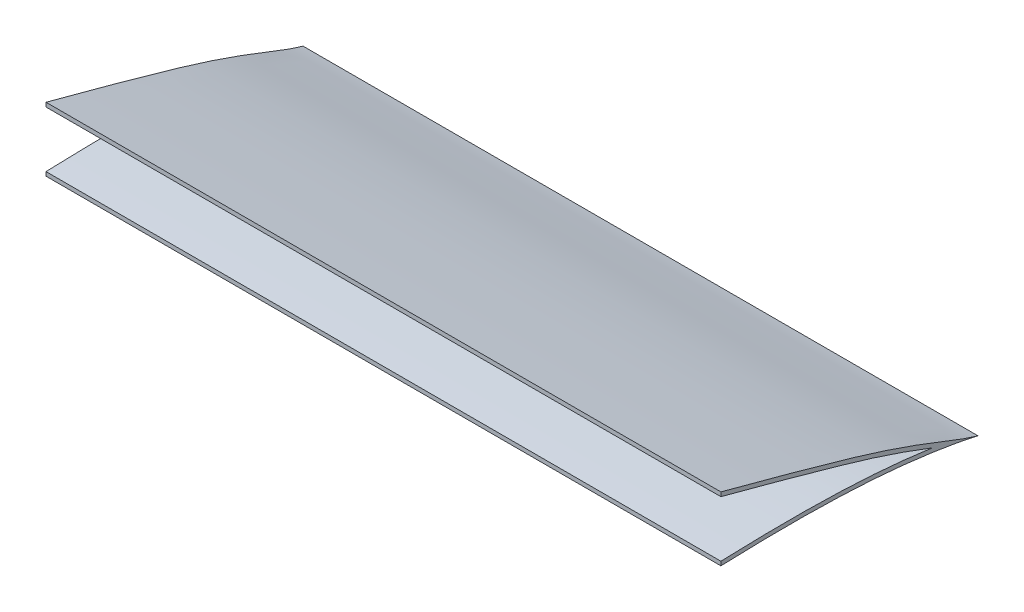
ISO-10303-21;
HEADER;
FILE_DESCRIPTION(('STEP AP214'),'2;1');
FILE_NAME('part.step','',(''),(''),'','','');
FILE_SCHEMA(('AUTOMOTIVE_DESIGN { 1 0 10303 214 1 1 1 1 }'));
ENDSEC;
DATA;
#1=APPLICATION_CONTEXT('core data for automotive mechanical design processes');
#2=APPLICATION_PROTOCOL_DEFINITION('international standard','automotive_design',2000,#1);
#3=PRODUCT_CONTEXT('',#1,'mechanical');
#4=PRODUCT('Part','Part','',(#3));
#5=PRODUCT_RELATED_PRODUCT_CATEGORY('part','',(#4));
#6=PRODUCT_DEFINITION_FORMATION('','',#4);
#7=PRODUCT_DEFINITION_CONTEXT('part definition',#1,'design');
#8=PRODUCT_DEFINITION('design','',#6,#7);
#9=PRODUCT_DEFINITION_SHAPE('','',#8);
#10=(LENGTH_UNIT() NAMED_UNIT(*) SI_UNIT(.MILLI.,.METRE.));
#11=(NAMED_UNIT(*) PLANE_ANGLE_UNIT() SI_UNIT($,.RADIAN.));
#12=(NAMED_UNIT(*) SI_UNIT($,.STERADIAN.) SOLID_ANGLE_UNIT());
#13=UNCERTAINTY_MEASURE_WITH_UNIT(LENGTH_MEASURE(1.E-05),#10,'distance_accuracy_value','');
#14=(GEOMETRIC_REPRESENTATION_CONTEXT(3) GLOBAL_UNCERTAINTY_ASSIGNED_CONTEXT((#13)) GLOBAL_UNIT_ASSIGNED_CONTEXT((#10,
#11,#12)) REPRESENTATION_CONTEXT('',''));
#15=CARTESIAN_POINT('',(0.,0.,0.));
#16=DIRECTION('',(0.,0.,1.));
#17=DIRECTION('',(1.,0.,0.));
#18=AXIS2_PLACEMENT_3D('',#15,#16,#17);
#19=CARTESIAN_POINT('',(266.7,-23.1184231765888,-784.106482277342));
#20=CARTESIAN_POINT('',(266.7,-21.5941948646314,-780.160330066746));
#21=CARTESIAN_POINT('',(266.7,-18.6420313640257,-772.229019430764));
#22=CARTESIAN_POINT('',(266.7,-14.6721592573552,-760.174514143023));
#23=CARTESIAN_POINT('',(266.7,-11.061270892252,-747.991113763068));
#24=CARTESIAN_POINT('',(266.7,-6.45595444735922,-731.645658465396));
#25=CARTESIAN_POINT('',(266.7,-0.845295728828582,-711.176791695));
#26=CARTESIAN_POINT('',(266.7,7.8115210058812,-678.329743560459));
#27=CARTESIAN_POINT('',(266.7,18.257538211217,-637.171287831332));
#28=CARTESIAN_POINT('',(266.7,30.1162057762093,-587.618318744646));
#29=CARTESIAN_POINT('',(266.7,41.1374524116112,-537.877742251688));
#30=CARTESIAN_POINT('',(266.7,51.0911698472495,-487.918910070674));
#31=CARTESIAN_POINT('',(266.7,59.7239737986415,-437.720761599895));
#32=CARTESIAN_POINT('',(266.7,66.7289053590127,-387.278741139135));
#33=CARTESIAN_POINT('',(266.7,70.9360377288318,-345.050560772716));
#34=CARTESIAN_POINT('',(266.7,73.0641477653892,-311.18788932569));
#35=CARTESIAN_POINT('',(266.7,74.2092196354668,-277.279562300467));
#36=CARTESIAN_POINT('',(266.7,73.8800008847884,-243.342738652409));
#37=CARTESIAN_POINT('',(266.7,71.9586220108794,-209.476353678726));
#38=CARTESIAN_POINT('',(266.7,69.6475228760495,-184.143820783248));
#39=CARTESIAN_POINT('',(266.7,66.4677558472745,-158.904994034112));
#40=CARTESIAN_POINT('',(266.7,62.3586391617327,-133.8071867013));
#41=CARTESIAN_POINT('',(266.7,57.1874016990518,-108.915504076387));
#42=CARTESIAN_POINT('',(266.7,51.8354380146184,-88.4250104282845));
#43=CARTESIAN_POINT('',(266.7,46.781142415969,-72.2737715807522));
#44=CARTESIAN_POINT('',(266.7,42.5401308058817,-60.3184424568568));
#45=CARTESIAN_POINT('',(266.7,37.7737253953122,-48.577097756103));
#46=CARTESIAN_POINT('',(266.7,32.3878283625538,-37.1196846287895));
#47=CARTESIAN_POINT('',(266.7,27.2537575462737,-27.9271564923142));
#48=CARTESIAN_POINT('',(266.7,22.6553737471211,-20.9063850305832));
#49=CARTESIAN_POINT('',(266.7,18.9075077927961,-15.8717047100105));
#50=CARTESIAN_POINT('',(266.7,14.8240531255331,-11.1186200473068));
#51=CARTESIAN_POINT('',(266.7,11.0807152552971,-7.55821558571599));
#52=CARTESIAN_POINT('',(266.7,7.83489505129662,-5.02510578688502));
#53=CARTESIAN_POINT('',(266.7,5.29547537768222,-3.38923844421585));
#54=CARTESIAN_POINT('',(266.7,3.06142620290842,-2.31109107008206));
#55=CARTESIAN_POINT('',(266.7,1.48593186176602,-1.80559091181272));
#56=CARTESIAN_POINT('',(266.7,0.72579482126348,-1.65397388534357));
#57=CARTESIAN_POINT('',(266.7,0.34989447911426,-1.61043534130219));
#58=CARTESIAN_POINT('',(266.7,0.100324503404875,-1.59546044383819));
#59=CARTESIAN_POINT('',(266.7,-0.0168698697803871,-1.58896756731634));
#60=B_SPLINE_CURVE_WITH_KNOTS('',3,(#19,#20,#21,#22,#23,#24,#25,#26,#27,#28,#29,#30,#31,#32,#33,
#34,#35,#36,#37,#38,#39,#40,#41,#42,#43,#44,#45,#46,#47,#48,#49,#50,#51,#52,#53,#54,#55,#56,#57,
#58,#59),.UNSPECIFIED.,.F.,.F.,(4,1,1,1,1,1,1,1,1,1,1,1,1,1,1,1,1,1,1,1,1,1,1,1,1,1,1,1,1,1,1,1,
1,1,1,1,1,1,4),(0.0222996498274626,0.0375748876942013,0.05285012556094,0.0681253634276787,
0.0834006012944174,0.113951077027895,0.144501552761372,0.205602504228327,0.266703455695282,
0.327804407162237,0.388905358629191,0.450006310096146,0.511107261563101,0.572208213030056,
0.602758688763533,0.633309164497011,0.694410115963965,0.724960591697443,0.75551106743092,
0.786061543164398,0.816612018897875,0.847162494631353,0.87771297036483,0.892988208231569,
0.908263446098307,0.923538683965046,0.938813921831785,0.954089159698523,0.961726778631893,
0.969364397565262,0.977002016498631,0.984639635432001,0.988458444898685,0.99227725436537,
0.996096063832055,0.998005468565397,0.998960170932068,0.999437522115404,0.999914873298739),.UNSPECIFIED.);
#61=DIRECTION('',(-1.,0.,0.));
#62=VECTOR('',#61,1.);
#63=SURFACE_OF_LINEAR_EXTRUSION('',#60,#62);
#64=CARTESIAN_POINT('',(0.,-23.1184231765888,-784.106482277342));
#65=CARTESIAN_POINT('',(0.,-21.5941948646314,-780.160330066746));
#66=CARTESIAN_POINT('',(0.,-18.6420313640257,-772.229019430764));
#67=CARTESIAN_POINT('',(0.,-14.6721592573552,-760.174514143023));
#68=CARTESIAN_POINT('',(0.,-11.061270892252,-747.991113763068));
#69=CARTESIAN_POINT('',(0.,-6.45595444735922,-731.645658465396));
#70=CARTESIAN_POINT('',(0.,-0.845295728828582,-711.176791695));
#71=CARTESIAN_POINT('',(0.,7.8115210058812,-678.329743560459));
#72=CARTESIAN_POINT('',(0.,18.257538211217,-637.171287831332));
#73=CARTESIAN_POINT('',(0.,30.1162057762093,-587.618318744646));
#74=CARTESIAN_POINT('',(0.,41.1374524116112,-537.877742251688));
#75=CARTESIAN_POINT('',(0.,51.0911698472495,-487.918910070674));
#76=CARTESIAN_POINT('',(0.,59.7239737986415,-437.720761599895));
#77=CARTESIAN_POINT('',(0.,66.7289053590127,-387.278741139135));
#78=CARTESIAN_POINT('',(0.,70.9360377288318,-345.050560772716));
#79=CARTESIAN_POINT('',(0.,73.0641477653892,-311.18788932569));
#80=CARTESIAN_POINT('',(0.,74.2092196354668,-277.279562300467));
#81=CARTESIAN_POINT('',(0.,73.8800008847884,-243.342738652409));
#82=CARTESIAN_POINT('',(0.,71.9586220108794,-209.476353678726));
#83=CARTESIAN_POINT('',(0.,69.6475228760495,-184.143820783248));
#84=CARTESIAN_POINT('',(0.,66.4677558472745,-158.904994034112));
#85=CARTESIAN_POINT('',(0.,62.3586391617327,-133.8071867013));
#86=CARTESIAN_POINT('',(0.,57.1874016990518,-108.915504076387));
#87=CARTESIAN_POINT('',(0.,51.8354380146184,-88.4250104282845));
#88=CARTESIAN_POINT('',(0.,46.781142415969,-72.2737715807522));
#89=CARTESIAN_POINT('',(0.,42.5401308058817,-60.3184424568568));
#90=CARTESIAN_POINT('',(0.,37.7737253953122,-48.577097756103));
#91=CARTESIAN_POINT('',(0.,32.3878283625538,-37.1196846287895));
#92=CARTESIAN_POINT('',(0.,27.2537575462737,-27.9271564923142));
#93=CARTESIAN_POINT('',(0.,22.6553737471211,-20.9063850305832));
#94=CARTESIAN_POINT('',(0.,18.9075077927961,-15.8717047100105));
#95=CARTESIAN_POINT('',(0.,14.8240531255331,-11.1186200473068));
#96=CARTESIAN_POINT('',(0.,11.0807152552971,-7.55821558571599));
#97=CARTESIAN_POINT('',(0.,7.83489505129662,-5.02510578688502));
#98=CARTESIAN_POINT('',(0.,5.29547537768222,-3.38923844421585));
#99=CARTESIAN_POINT('',(0.,3.06142620290842,-2.31109107008206));
#100=CARTESIAN_POINT('',(0.,1.48593186176602,-1.80559091181272));
#101=CARTESIAN_POINT('',(0.,0.72579482126348,-1.65397388534357));
#102=CARTESIAN_POINT('',(0.,0.34989447911426,-1.61043534130219));
#103=CARTESIAN_POINT('',(0.,0.100324503404875,-1.59546044383819));
#104=CARTESIAN_POINT('',(0.,-0.0168698697803871,-1.58896756731634));
#105=B_SPLINE_CURVE_WITH_KNOTS('',3,(#64,#65,#66,#67,#68,#69,#70,#71,#72,#73,#74,#75,#76,#77,
#78,#79,#80,#81,#82,#83,#84,#85,#86,#87,#88,#89,#90,#91,#92,#93,#94,#95,#96,#97,#98,#99,#100,
#101,#102,#103,#104),.UNSPECIFIED.,.F.,.F.,(4,1,1,1,1,1,1,1,1,1,1,1,1,1,1,1,1,1,1,1,1,1,1,1,1,1,
1,1,1,1,1,1,1,1,1,1,1,1,4),(0.0222996498274626,0.0375748876942013,0.05285012556094,
0.0681253634276787,0.0834006012944174,0.113951077027895,0.144501552761372,0.205602504228327,
0.266703455695282,0.327804407162237,0.388905358629191,0.450006310096146,0.511107261563101,
0.572208213030056,0.602758688763533,0.633309164497011,0.694410115963965,0.724960591697443,
0.75551106743092,0.786061543164398,0.816612018897875,0.847162494631353,0.87771297036483,
0.892988208231569,0.908263446098307,0.923538683965046,0.938813921831785,0.954089159698523,
0.961726778631893,0.969364397565262,0.977002016498631,0.984639635432001,0.988458444898685,
0.99227725436537,0.996096063832055,0.998005468565397,0.998960170932068,0.999437522115404,
0.999914873298739),.UNSPECIFIED.);
#106=CARTESIAN_POINT('',(0.,-23.1184231765888,-784.106482277342));
#107=VERTEX_POINT('',#106);
#108=CARTESIAN_POINT('',(0.,1.94501203006148,-700.551053398584));
#109=VERTEX_POINT('',#108);
#110=EDGE_CURVE('E122',#107,#109,#105,.T.);
#111=ORIENTED_EDGE('',*,*,#110,.F.);
#112=DIRECTION('',(-1.,0.,0.));
#113=VECTOR('',#112,1.);
#114=CARTESIAN_POINT('',(266.7,-23.1184231765888,-784.106482277342));
#115=LINE('',#114,#113);
#116=CARTESIAN_POINT('',(266.7,-23.1184231765888,-784.106482277342));
#117=VERTEX_POINT('',#116);
#118=EDGE_CURVE('E11',#117,#107,#115,.T.);
#119=ORIENTED_EDGE('',*,*,#118,.F.);
#120=CARTESIAN_POINT('',(266.7,1.94501203006148,-700.551053398584));
#121=VERTEX_POINT('',#120);
#122=EDGE_CURVE('E146',#117,#121,#60,.T.);
#123=ORIENTED_EDGE('',*,*,#122,.T.);
#124=DIRECTION('',(-1.,0.,0.));
#125=VECTOR('',#124,1.);
#126=CARTESIAN_POINT('',(266.7,1.94501203006148,-700.551053398584));
#127=LINE('',#126,#125);
#128=EDGE_CURVE('E81',#121,#109,#127,.T.);
#129=ORIENTED_EDGE('',*,*,#128,.T.);
#130=EDGE_LOOP('',(#111,#119,#123,#129));
#131=FACE_BOUND('',#130,.T.);
#132=ADVANCED_FACE('F35',(#131),#63,.T.);
#133=CARTESIAN_POINT('',(266.7,-0.0168698697803817,-1.58896756731634));
#134=CARTESIAN_POINT('',(266.7,-0.278093575405853,-1.59778567538342));
#135=CARTESIAN_POINT('',(266.7,-0.817071560687652,-1.61698852295705));
#136=CARTESIAN_POINT('',(266.7,-1.5250777063707,-1.67055282833132));
#137=CARTESIAN_POINT('',(266.7,-2.23953985681244,-1.77272911801303));
#138=CARTESIAN_POINT('',(266.7,-3.2170399545111,-1.96449824112025));
#139=CARTESIAN_POINT('',(266.7,-4.47308667544305,-2.28220569209763));
#140=CARTESIAN_POINT('',(266.7,-6.45569044251883,-2.89195735088694));
#141=CARTESIAN_POINT('',(266.7,-8.91270651117956,-3.82502314776842));
#142=CARTESIAN_POINT('',(266.7,-12.764870838745,-5.5748206630622));
#143=CARTESIAN_POINT('',(266.7,-17.4946939025467,-8.15485573251682));
#144=CARTESIAN_POINT('',(266.7,-25.0362925123383,-12.5101141172109));
#145=CARTESIAN_POINT('',(266.7,-34.2942736430627,-18.1123469115671));
#146=CARTESIAN_POINT('',(266.7,-45.1810251619868,-25.230105591362));
#147=CARTESIAN_POINT('',(266.7,-53.8227317037622,-31.689080193494));
#148=CARTESIAN_POINT('',(266.7,-60.4726069561864,-37.2128263714012));
#149=CARTESIAN_POINT('',(266.7,-66.962933883926,-42.9501181028563));
#150=CARTESIAN_POINT('',(266.7,-74.4394415189749,-50.6018486257846));
#151=CARTESIAN_POINT('',(266.7,-81.5128401744618,-61.3489491705267));
#152=CARTESIAN_POINT('',(266.7,-86.5672767678429,-73.159446713042));
#153=CARTESIAN_POINT('',(266.7,-90.1112052326867,-85.6410448979768));
#154=CARTESIAN_POINT('',(266.7,-92.857558138955,-98.3222524640694));
#155=CARTESIAN_POINT('',(266.7,-95.4884593166877,-115.423728280371));
#156=CARTESIAN_POINT('',(266.7,-97.1574166185787,-137.057042994171));
#157=CARTESIAN_POINT('',(266.7,-97.3913575328663,-163.09710904146));
#158=CARTESIAN_POINT('',(266.7,-96.2564047503436,-189.13539327614));
#159=CARTESIAN_POINT('',(266.7,-94.0860606996018,-215.119495237718));
#160=CARTESIAN_POINT('',(266.7,-91.1098097619557,-241.033805840036));
#161=CARTESIAN_POINT('',(266.7,-86.3075505253941,-275.492090275555));
#162=CARTESIAN_POINT('',(266.7,-79.1224787107728,-318.404073319138));
#163=CARTESIAN_POINT('',(266.7,-69.4844112272533,-369.735601224399));
#164=CARTESIAN_POINT('',(266.7,-59.4768027176839,-421.013521647914));
#165=CARTESIAN_POINT('',(266.7,-49.6150737617801,-472.334965082267));
#166=CARTESIAN_POINT('',(266.7,-40.3589258634731,-523.784524343132));
#167=CARTESIAN_POINT('',(266.7,-32.1357040424635,-575.425677634064));
#168=CARTESIAN_POINT('',(266.7,-25.4119138999749,-627.302116658694));
#169=CARTESIAN_POINT('',(266.7,-21.5032379052925,-670.741751073083));
#170=CARTESIAN_POINT('',(266.7,-19.8162969755378,-705.603952790565));
#171=CARTESIAN_POINT('',(266.7,-19.41220767749,-731.78903132868));
#172=CARTESIAN_POINT('',(266.7,-20.1502189024007,-758.00034587372));
#173=CARTESIAN_POINT('',(266.7,-21.867269156407,-775.446944988084));
#174=CARTESIAN_POINT('',(266.7,-23.1184231765888,-784.106482277342));
#175=B_SPLINE_CURVE_WITH_KNOTS('',3,(#133,#134,#135,#136,#137,#138,#139,#140,#141,#142,#143,
#144,#145,#146,#147,#148,#149,#150,#151,#152,#153,#154,#155,#156,#157,#158,#159,#160,#161,#162,
#163,#164,#165,#166,#167,#168,#169,#170,#171,#172,#173,#174),.UNSPECIFIED.,.F.,.F.,(4,1,1,1,1,1,
1,1,1,1,1,1,1,1,1,1,1,1,1,1,1,1,1,1,1,1,1,1,1,1,1,1,1,1,1,1,1,1,1,4),(8.23654502113766E-05,
0.00103762246756374,0.00199287948491611,0.00294813650226847,0.00390339351962084,
0.00581390755432556,0.00772442158903029,0.0115454496584398,0.0153664777278492,
0.0230085338666681,0.030650590005487,0.0459347022831249,0.0612188145607627,0.0765029268384006,
0.0841449829772195,0.0917870391160384,0.107071151393676,0.122355263671314,0.137639375948952,
0.15292348822659,0.168207600504228,0.183491712781865,0.214059937337141,0.244628161892417,
0.275196386447692,0.305764611002968,0.336332835558244,0.366901060113519,0.428037509224071,
0.489173958334622,0.550310407445173,0.611446856555725,0.672583305666276,0.733719754776827,
0.794856203887379,0.85599265299793,0.886560877553206,0.917129102108482,0.947697326663757,
0.978265551219033),.UNSPECIFIED.);
#176=DIRECTION('',(-1.,0.,0.));
#177=VECTOR('',#176,1.);
#178=SURFACE_OF_LINEAR_EXTRUSION('',#175,#177);
#179=CARTESIAN_POINT('',(0.,-0.0168698697803817,-1.58896756731634));
#180=CARTESIAN_POINT('',(0.,-0.278093575405853,-1.59778567538342));
#181=CARTESIAN_POINT('',(0.,-0.817071560687652,-1.61698852295705));
#182=CARTESIAN_POINT('',(0.,-1.5250777063707,-1.67055282833132));
#183=CARTESIAN_POINT('',(0.,-2.23953985681244,-1.77272911801303));
#184=CARTESIAN_POINT('',(0.,-3.2170399545111,-1.96449824112025));
#185=CARTESIAN_POINT('',(0.,-4.47308667544305,-2.28220569209763));
#186=CARTESIAN_POINT('',(0.,-6.45569044251883,-2.89195735088694));
#187=CARTESIAN_POINT('',(0.,-8.91270651117956,-3.82502314776842));
#188=CARTESIAN_POINT('',(0.,-12.764870838745,-5.5748206630622));
#189=CARTESIAN_POINT('',(0.,-17.4946939025467,-8.15485573251682));
#190=CARTESIAN_POINT('',(0.,-25.0362925123383,-12.5101141172109));
#191=CARTESIAN_POINT('',(0.,-34.2942736430627,-18.1123469115671));
#192=CARTESIAN_POINT('',(0.,-45.1810251619868,-25.230105591362));
#193=CARTESIAN_POINT('',(0.,-53.8227317037622,-31.689080193494));
#194=CARTESIAN_POINT('',(0.,-60.4726069561864,-37.2128263714012));
#195=CARTESIAN_POINT('',(0.,-66.962933883926,-42.9501181028563));
#196=CARTESIAN_POINT('',(0.,-74.4394415189749,-50.6018486257846));
#197=CARTESIAN_POINT('',(0.,-81.5128401744618,-61.3489491705267));
#198=CARTESIAN_POINT('',(0.,-86.5672767678429,-73.159446713042));
#199=CARTESIAN_POINT('',(0.,-90.1112052326867,-85.6410448979768));
#200=CARTESIAN_POINT('',(0.,-92.857558138955,-98.3222524640694));
#201=CARTESIAN_POINT('',(0.,-95.4884593166877,-115.423728280371));
#202=CARTESIAN_POINT('',(0.,-97.1574166185787,-137.057042994171));
#203=CARTESIAN_POINT('',(0.,-97.3913575328663,-163.09710904146));
#204=CARTESIAN_POINT('',(0.,-96.2564047503436,-189.13539327614));
#205=CARTESIAN_POINT('',(0.,-94.0860606996018,-215.119495237718));
#206=CARTESIAN_POINT('',(0.,-91.1098097619557,-241.033805840036));
#207=CARTESIAN_POINT('',(0.,-86.3075505253941,-275.492090275555));
#208=CARTESIAN_POINT('',(0.,-79.1224787107728,-318.404073319138));
#209=CARTESIAN_POINT('',(0.,-69.4844112272533,-369.735601224399));
#210=CARTESIAN_POINT('',(0.,-59.4768027176839,-421.013521647914));
#211=CARTESIAN_POINT('',(0.,-49.6150737617801,-472.334965082267));
#212=CARTESIAN_POINT('',(0.,-40.3589258634731,-523.784524343132));
#213=CARTESIAN_POINT('',(0.,-32.1357040424635,-575.425677634064));
#214=CARTESIAN_POINT('',(0.,-25.4119138999749,-627.302116658694));
#215=CARTESIAN_POINT('',(0.,-21.5032379052925,-670.741751073083));
#216=CARTESIAN_POINT('',(0.,-19.8162969755378,-705.603952790565));
#217=CARTESIAN_POINT('',(0.,-19.41220767749,-731.78903132868));
#218=CARTESIAN_POINT('',(0.,-20.1502189024007,-758.00034587372));
#219=CARTESIAN_POINT('',(0.,-21.867269156407,-775.446944988084));
#220=CARTESIAN_POINT('',(0.,-23.1184231765888,-784.106482277342));
#221=B_SPLINE_CURVE_WITH_KNOTS('',3,(#179,#180,#181,#182,#183,#184,#185,#186,#187,#188,#189,
#190,#191,#192,#193,#194,#195,#196,#197,#198,#199,#200,#201,#202,#203,#204,#205,#206,#207,#208,
#209,#210,#211,#212,#213,#214,#215,#216,#217,#218,#219,#220),.UNSPECIFIED.,.F.,.F.,(4,1,1,1,1,1,
1,1,1,1,1,1,1,1,1,1,1,1,1,1,1,1,1,1,1,1,1,1,1,1,1,1,1,1,1,1,1,1,1,4),(8.23654502113766E-05,
0.00103762246756374,0.00199287948491611,0.00294813650226847,0.00390339351962084,
0.00581390755432556,0.00772442158903029,0.0115454496584398,0.0153664777278492,
0.0230085338666681,0.030650590005487,0.0459347022831249,0.0612188145607627,0.0765029268384006,
0.0841449829772195,0.0917870391160384,0.107071151393676,0.122355263671314,0.137639375948952,
0.15292348822659,0.168207600504228,0.183491712781865,0.214059937337141,0.244628161892417,
0.275196386447692,0.305764611002968,0.336332835558244,0.366901060113519,0.428037509224071,
0.489173958334622,0.550310407445173,0.611446856555725,0.672583305666276,0.733719754776827,
0.794856203887379,0.85599265299793,0.886560877553206,0.917129102108482,0.947697326663757,
0.978265551219033),.UNSPECIFIED.);
#222=CARTESIAN_POINT('',(0.,-20.1371548542674,-700.551053398605));
#223=VERTEX_POINT('',#222);
#224=EDGE_CURVE('E164',#223,#107,#221,.T.);
#225=ORIENTED_EDGE('',*,*,#224,.F.);
#226=DIRECTION('',(-1.,0.,0.));
#227=VECTOR('',#226,1.);
#228=CARTESIAN_POINT('',(266.7,-20.1371548542674,-700.551053398605));
#229=LINE('',#228,#227);
#230=CARTESIAN_POINT('',(266.7,-20.1371548542674,-700.551053398605));
#231=VERTEX_POINT('',#230);
#232=EDGE_CURVE('E44',#231,#223,#229,.T.);
#233=ORIENTED_EDGE('',*,*,#232,.F.);
#234=EDGE_CURVE('E141',#231,#117,#175,.T.);
#235=ORIENTED_EDGE('',*,*,#234,.T.);
#236=ORIENTED_EDGE('',*,*,#118,.T.);
#237=EDGE_LOOP('',(#225,#233,#235,#236));
#238=FACE_BOUND('',#237,.T.);
#239=ADVANCED_FACE('F137',(#238),#178,.T.);
#240=CARTESIAN_POINT('',(266.7,6.69871026456157E-10,-700.551053398586));
#241=DIRECTION('',(0.,9.56205865663051E-13,-1.));
#242=DIRECTION('',(0.,1.,9.56205865663051E-13));
#243=AXIS2_PLACEMENT_3D('',#240,#241,#242);
#244=PLANE('',#243);
#245=DIRECTION('',(0.,-1.,-9.56205865663051E-13));
#246=VECTOR('',#245,1.);
#247=CARTESIAN_POINT('',(0.,6.69871026456157E-10,-700.551053398586));
#248=LINE('',#247,#246);
#249=CARTESIAN_POINT('',(0.,-21.7251284021518,-700.551053398607));
#250=VERTEX_POINT('',#249);
#251=EDGE_CURVE('E158',#223,#250,#248,.T.);
#252=ORIENTED_EDGE('',*,*,#251,.T.);
#253=DIRECTION('',(-1.,0.,0.));
#254=VECTOR('',#253,1.);
#255=CARTESIAN_POINT('',(266.7,-21.7251284021518,-700.551053398607));
#256=LINE('',#255,#254);
#257=CARTESIAN_POINT('',(266.7,-21.7251284021518,-700.551053398607));
#258=VERTEX_POINT('',#257);
#259=EDGE_CURVE('E109',#258,#250,#256,.T.);
#260=ORIENTED_EDGE('',*,*,#259,.F.);
#261=DIRECTION('',(0.,-1.,-9.56205865663051E-13));
#262=VECTOR('',#261,1.);
#263=CARTESIAN_POINT('',(266.7,6.69871026456157E-10,-700.551053398586));
#264=LINE('',#263,#262);
#265=EDGE_CURVE('E100',#231,#258,#264,.T.);
#266=ORIENTED_EDGE('',*,*,#265,.F.);
#267=ORIENTED_EDGE('',*,*,#232,.T.);
#268=EDGE_LOOP('',(#252,#260,#266,#267));
#269=FACE_BOUND('',#268,.T.);
#270=ADVANCED_FACE('F136',(#269),#244,.F.);
#271=CARTESIAN_POINT('',(266.7,0.,0.));
#272=CARTESIAN_POINT('',(266.7,-0.519005663292632,-0.0174520328861116));
#273=CARTESIAN_POINT('',(266.7,-1.83376590693266,-0.061662030289511));
#274=CARTESIAN_POINT('',(266.7,-4.39681155697538,-0.570189514846942));
#275=CARTESIAN_POINT('',(266.7,-10.616386461847,-2.53612961983818));
#276=CARTESIAN_POINT('',(266.7,-20.5501355548529,-7.99821180017807));
#277=CARTESIAN_POINT('',(266.7,-34.1849518234535,-16.113653600375));
#278=CARTESIAN_POINT('',(266.7,-48.9001609581786,-25.7512677237822));
#279=CARTESIAN_POINT('',(266.7,-62.9387722638163,-36.9320129206869));
#280=CARTESIAN_POINT('',(266.7,-75.9185649305712,-49.3363693896182));
#281=CARTESIAN_POINT('',(266.7,-85.624987008219,-65.2269065390065));
#282=CARTESIAN_POINT('',(266.7,-91.71735718507,-84.4527650462028));
#283=CARTESIAN_POINT('',(266.7,-96.1515107337894,-106.852134497523));
#284=CARTESIAN_POINT('',(266.7,-98.5722491750476,-132.510932075963));
#285=CARTESIAN_POINT('',(266.7,-99.0923828679645,-161.194365788224));
#286=CARTESIAN_POINT('',(266.7,-97.7042437107787,-192.761343292225));
#287=CARTESIAN_POINT('',(266.7,-94.5118392960459,-227.038217577419));
#288=CARTESIAN_POINT('',(266.7,-89.663828122523,-263.83475650239));
#289=CARTESIAN_POINT('',(266.7,-83.3884450275924,-302.921473177171));
#290=CARTESIAN_POINT('',(266.7,-75.9777868038423,-344.017776041379));
#291=CARTESIAN_POINT('',(266.7,-67.7807073824771,-386.776799789042));
#292=CARTESIAN_POINT('',(266.7,-59.2023239554423,-430.774614869895));
#293=CARTESIAN_POINT('',(266.7,-50.6638051202139,-475.496263681326));
#294=CARTESIAN_POINT('',(266.7,-42.603612471025,-520.335279967164));
#295=CARTESIAN_POINT('',(266.7,-35.4227963472458,-564.588870456427));
#296=CARTESIAN_POINT('',(266.7,-29.4733080838417,-607.47093439983));
#297=CARTESIAN_POINT('',(266.7,-25.014473383068,-648.127538759033));
#298=CARTESIAN_POINT('',(266.7,-22.1862417823146,-685.667615873141));
#299=CARTESIAN_POINT('',(266.7,-21.0047614095552,-719.196759596274));
#300=CARTESIAN_POINT('',(266.7,-21.2786363123237,-747.830287498204));
#301=CARTESIAN_POINT('',(266.7,-22.8547119223691,-770.688405742871));
#302=CARTESIAN_POINT('',(266.7,-25.0735156397946,-787.091395164099));
#303=CARTESIAN_POINT('',(266.7,-26.8193281874914,-796.842303094868));
#304=CARTESIAN_POINT('',(266.7,-27.775140745329,-801.097715575015));
#305=CARTESIAN_POINT('',(266.7,-28.0117320332953,-802.151053398607));
#306=B_SPLINE_CURVE_WITH_KNOTS('',3,(#271,#272,#273,#274,#275,#276,#277,#278,#279,#280,#281,
#282,#283,#284,#285,#286,#287,#288,#289,#290,#291,#292,#293,#294,#295,#296,#297,#298,#299,#300,
#301,#302,#303,#304,#305),.UNSPECIFIED.,.F.,.F.,(4,1,1,1,1,1,1,1,1,1,1,1,1,1,1,1,1,1,1,1,1,1,1,
1,1,1,1,1,1,1,1,1,4),(0.,0.00182090933464196,0.00461278049497482,0.00913453013845994,
0.0246759391487866,0.0441527676320363,0.064937102928184,0.0863209881898911,0.107137618403306,
0.127599776801144,0.150892792929449,0.177565203441126,0.207667777211646,0.241222088418686,
0.278203414074027,0.318526302563412,0.362030578586225,0.408464624639153,0.457479061609077,
0.508614437318857,0.56129601455956,0.61483529472868,0.668437533813961,0.721214466101836,
0.772202341152847,0.82039348306447,0.86476592329606,0.904323703961063,0.938131580580512,
0.965241743376092,0.984690446789536,0.996210442222917,1.),.UNSPECIFIED.);
#307=DIRECTION('',(-1.,0.,0.));
#308=VECTOR('',#307,1.);
#309=SURFACE_OF_LINEAR_EXTRUSION('',#306,#308);
#310=CARTESIAN_POINT('',(0.,0.,0.));
#311=CARTESIAN_POINT('',(0.,-0.519005663292632,-0.0174520328861116));
#312=CARTESIAN_POINT('',(0.,-1.83376590693266,-0.061662030289511));
#313=CARTESIAN_POINT('',(0.,-4.39681155697538,-0.570189514846942));
#314=CARTESIAN_POINT('',(0.,-10.616386461847,-2.53612961983818));
#315=CARTESIAN_POINT('',(0.,-20.5501355548529,-7.99821180017807));
#316=CARTESIAN_POINT('',(0.,-34.1849518234535,-16.113653600375));
#317=CARTESIAN_POINT('',(0.,-48.9001609581786,-25.7512677237822));
#318=CARTESIAN_POINT('',(0.,-62.9387722638163,-36.9320129206869));
#319=CARTESIAN_POINT('',(0.,-75.9185649305712,-49.3363693896182));
#320=CARTESIAN_POINT('',(0.,-85.624987008219,-65.2269065390065));
#321=CARTESIAN_POINT('',(0.,-91.71735718507,-84.4527650462028));
#322=CARTESIAN_POINT('',(0.,-96.1515107337894,-106.852134497523));
#323=CARTESIAN_POINT('',(0.,-98.5722491750476,-132.510932075963));
#324=CARTESIAN_POINT('',(0.,-99.0923828679645,-161.194365788224));
#325=CARTESIAN_POINT('',(0.,-97.7042437107787,-192.761343292225));
#326=CARTESIAN_POINT('',(0.,-94.5118392960459,-227.038217577419));
#327=CARTESIAN_POINT('',(0.,-89.663828122523,-263.83475650239));
#328=CARTESIAN_POINT('',(0.,-83.3884450275924,-302.921473177171));
#329=CARTESIAN_POINT('',(0.,-75.9777868038423,-344.017776041379));
#330=CARTESIAN_POINT('',(0.,-67.7807073824771,-386.776799789042));
#331=CARTESIAN_POINT('',(0.,-59.2023239554423,-430.774614869895));
#332=CARTESIAN_POINT('',(0.,-50.6638051202139,-475.496263681326));
#333=CARTESIAN_POINT('',(0.,-42.603612471025,-520.335279967164));
#334=CARTESIAN_POINT('',(0.,-35.4227963472458,-564.588870456427));
#335=CARTESIAN_POINT('',(0.,-29.4733080838417,-607.47093439983));
#336=CARTESIAN_POINT('',(0.,-25.014473383068,-648.127538759033));
#337=CARTESIAN_POINT('',(0.,-22.1862417823146,-685.667615873141));
#338=CARTESIAN_POINT('',(0.,-21.0047614095552,-719.196759596274));
#339=CARTESIAN_POINT('',(0.,-21.2786363123237,-747.830287498204));
#340=CARTESIAN_POINT('',(0.,-22.8547119223691,-770.688405742871));
#341=CARTESIAN_POINT('',(0.,-25.0735156397946,-787.091395164099));
#342=CARTESIAN_POINT('',(0.,-26.8193281874914,-796.842303094868));
#343=CARTESIAN_POINT('',(0.,-27.775140745329,-801.097715575015));
#344=CARTESIAN_POINT('',(0.,-28.0117320332953,-802.151053398607));
#345=B_SPLINE_CURVE_WITH_KNOTS('',3,(#310,#311,#312,#313,#314,#315,#316,#317,#318,#319,#320,
#321,#322,#323,#324,#325,#326,#327,#328,#329,#330,#331,#332,#333,#334,#335,#336,#337,#338,#339,
#340,#341,#342,#343,#344),.UNSPECIFIED.,.F.,.F.,(4,1,1,1,1,1,1,1,1,1,1,1,1,1,1,1,1,1,1,1,1,1,1,
1,1,1,1,1,1,1,1,1,4),(0.,0.00182090933464196,0.00461278049497482,0.00913453013845994,
0.0246759391487866,0.0441527676320363,0.064937102928184,0.0863209881898911,0.107137618403306,
0.127599776801144,0.150892792929449,0.177565203441126,0.207667777211646,0.241222088418686,
0.278203414074027,0.318526302563412,0.362030578586225,0.408464624639153,0.457479061609077,
0.508614437318857,0.56129601455956,0.61483529472868,0.668437533813961,0.721214466101836,
0.772202341152847,0.82039348306447,0.86476592329606,0.904323703961063,0.938131580580512,
0.965241743376092,0.984690446789536,0.996210442222917,1.),.UNSPECIFIED.);
#346=CARTESIAN_POINT('',(0.,-28.0117320332953,-802.151053398607));
#347=VERTEX_POINT('',#346);
#348=EDGE_CURVE('E108',#250,#347,#345,.T.);
#349=ORIENTED_EDGE('',*,*,#348,.T.);
#350=DIRECTION('',(-1.,0.,0.));
#351=VECTOR('',#350,1.);
#352=CARTESIAN_POINT('',(266.7,-28.0117320332953,-802.151053398607));
#353=LINE('',#352,#351);
#354=CARTESIAN_POINT('',(266.7,-28.0117320332953,-802.151053398607));
#355=VERTEX_POINT('',#354);
#356=EDGE_CURVE('E105',#355,#347,#353,.T.);
#357=ORIENTED_EDGE('',*,*,#356,.F.);
#358=EDGE_CURVE('E93',#258,#355,#306,.T.);
#359=ORIENTED_EDGE('',*,*,#358,.F.);
#360=ORIENTED_EDGE('',*,*,#259,.T.);
#361=EDGE_LOOP('',(#349,#357,#359,#360));
#362=FACE_BOUND('',#361,.T.);
#363=ADVANCED_FACE('F106',(#362),#309,.F.);
#364=CARTESIAN_POINT('',(266.7,-28.0117320332953,-802.151053398607));
#365=CARTESIAN_POINT('',(266.7,-27.710542123527,-801.137231832094));
#366=CARTESIAN_POINT('',(266.7,-26.5641562510043,-797.27843482904));
#367=CARTESIAN_POINT('',(266.7,-23.4586005929967,-789.357225955684));
#368=CARTESIAN_POINT('',(266.7,-18.6435790763375,-777.061460680268));
#369=CARTESIAN_POINT('',(266.7,-13.0400649658381,-760.581722213746));
#370=CARTESIAN_POINT('',(266.7,-7.12332820030123,-739.996750309993));
#371=CARTESIAN_POINT('',(266.7,-0.379813283345798,-715.577161880778));
#372=CARTESIAN_POINT('',(266.7,7.01302179783245,-687.646997388539));
#373=CARTESIAN_POINT('',(266.7,14.9584437350511,-656.683490082775));
#374=CARTESIAN_POINT('',(266.7,23.2583450492127,-623.158916560161));
#375=CARTESIAN_POINT('',(266.7,31.6943761736674,-587.549187867877));
#376=CARTESIAN_POINT('',(266.7,40.0261592775003,-550.319226889969));
#377=CARTESIAN_POINT('',(266.7,48.0016259470583,-511.914813654707));
#378=CARTESIAN_POINT('',(266.7,55.3745384751683,-472.761711336754));
#379=CARTESIAN_POINT('',(266.7,61.9127756172881,-433.262164148396));
#380=CARTESIAN_POINT('',(266.7,67.4048011857371,-393.795881301516));
#381=CARTESIAN_POINT('',(266.7,71.6551802592027,-354.719946084308));
#382=CARTESIAN_POINT('',(266.7,74.5356984509869,-316.356950184404));
#383=CARTESIAN_POINT('',(266.7,75.7535877143478,-278.931254813958));
#384=CARTESIAN_POINT('',(266.7,75.3938232859782,-242.699408929645));
#385=CARTESIAN_POINT('',(266.7,73.5466559514192,-207.870582877272));
#386=CARTESIAN_POINT('',(266.7,70.258980651523,-174.746776105035));
#387=CARTESIAN_POINT('',(266.7,65.7681833794804,-143.601377812826));
#388=CARTESIAN_POINT('',(266.7,60.1874606388379,-114.762118238718));
#389=CARTESIAN_POINT('',(266.7,53.6284711640925,-88.5344901534865));
#390=CARTESIAN_POINT('',(266.7,46.2382231047102,-65.1989800418067));
#391=CARTESIAN_POINT('',(266.7,38.1338729096646,-45.0005898028485));
#392=CARTESIAN_POINT('',(266.7,29.5092329049809,-28.1586169294181));
#393=CARTESIAN_POINT('',(266.7,20.5578270147304,-14.8710331109971));
#394=CARTESIAN_POINT('',(266.7,12.3132643572985,-6.1441914315733));
#395=CARTESIAN_POINT('',(266.7,6.17648660122838,-1.94810257769001));
#396=CARTESIAN_POINT('',(266.7,3.08412263305227,-0.639134364132099));
#397=CARTESIAN_POINT('',(266.7,1.6680303470529,-0.217045478268119));
#398=CARTESIAN_POINT('',(266.7,0.777840261416918,-0.0425630889701045));
#399=CARTESIAN_POINT('',(266.7,0.196310087268892,-0.0107420046483453));
#400=CARTESIAN_POINT('',(266.7,0.,0.));
#401=B_SPLINE_CURVE_WITH_KNOTS('',3,(#364,#365,#366,#367,#368,#369,#370,#371,#372,#373,#374,
#375,#376,#377,#378,#379,#380,#381,#382,#383,#384,#385,#386,#387,#388,#389,#390,#391,#392,#393,
#394,#395,#396,#397,#398,#399,#400),.UNSPECIFIED.,.F.,.F.,(4,1,1,1,1,1,1,1,1,1,1,1,1,1,1,1,1,1,
1,1,1,1,1,1,1,1,1,1,1,1,1,1,1,1,4),(0.,0.0038023449945569,0.0144724456001439,0.0305636248499039,
0.0512990586437873,0.0770284704780323,0.1075738110133,0.142399412839652,0.180921149261364,
0.222524680037491,0.266590974271359,0.312514686460119,0.359710118436383,0.407632336843648,
0.455773216728113,0.503669018265595,0.550900956266296,0.59709618330248,0.64197604819215,
0.685511898484932,0.727353251544964,0.767353583197193,0.805169064220494,0.840471251936796,
0.872937278412314,0.902335208905147,0.928425322985344,0.95111304623239,0.970252676129248,
0.985871491026606,0.993981783732224,0.996752649298779,0.997906779196307,0.999293380847839,1.),.UNSPECIFIED.);
#402=DIRECTION('',(-1.,0.,0.));
#403=VECTOR('',#402,1.);
#404=SURFACE_OF_LINEAR_EXTRUSION('',#401,#403);
#405=CARTESIAN_POINT('',(0.,-28.0117320332953,-802.151053398607));
#406=CARTESIAN_POINT('',(0.,-27.710542123527,-801.137231832094));
#407=CARTESIAN_POINT('',(0.,-26.5641562510043,-797.27843482904));
#408=CARTESIAN_POINT('',(0.,-23.4586005929967,-789.357225955684));
#409=CARTESIAN_POINT('',(0.,-18.6435790763375,-777.061460680268));
#410=CARTESIAN_POINT('',(0.,-13.0400649658381,-760.581722213746));
#411=CARTESIAN_POINT('',(0.,-7.12332820030123,-739.996750309993));
#412=CARTESIAN_POINT('',(0.,-0.379813283345798,-715.577161880778));
#413=CARTESIAN_POINT('',(0.,7.01302179783245,-687.646997388539));
#414=CARTESIAN_POINT('',(0.,14.9584437350511,-656.683490082775));
#415=CARTESIAN_POINT('',(0.,23.2583450492127,-623.158916560161));
#416=CARTESIAN_POINT('',(0.,31.6943761736674,-587.549187867877));
#417=CARTESIAN_POINT('',(0.,40.0261592775003,-550.319226889969));
#418=CARTESIAN_POINT('',(0.,48.0016259470583,-511.914813654707));
#419=CARTESIAN_POINT('',(0.,55.3745384751683,-472.761711336754));
#420=CARTESIAN_POINT('',(0.,61.9127756172881,-433.262164148396));
#421=CARTESIAN_POINT('',(0.,67.4048011857371,-393.795881301516));
#422=CARTESIAN_POINT('',(0.,71.6551802592027,-354.719946084308));
#423=CARTESIAN_POINT('',(0.,74.5356984509869,-316.356950184404));
#424=CARTESIAN_POINT('',(0.,75.7535877143478,-278.931254813958));
#425=CARTESIAN_POINT('',(0.,75.3938232859782,-242.699408929645));
#426=CARTESIAN_POINT('',(0.,73.5466559514192,-207.870582877272));
#427=CARTESIAN_POINT('',(0.,70.258980651523,-174.746776105035));
#428=CARTESIAN_POINT('',(0.,65.7681833794804,-143.601377812826));
#429=CARTESIAN_POINT('',(0.,60.1874606388379,-114.762118238718));
#430=CARTESIAN_POINT('',(0.,53.6284711640925,-88.5344901534865));
#431=CARTESIAN_POINT('',(0.,46.2382231047102,-65.1989800418067));
#432=CARTESIAN_POINT('',(0.,38.1338729096646,-45.0005898028485));
#433=CARTESIAN_POINT('',(0.,29.5092329049809,-28.1586169294181));
#434=CARTESIAN_POINT('',(0.,20.5578270147304,-14.8710331109971));
#435=CARTESIAN_POINT('',(0.,12.3132643572985,-6.1441914315733));
#436=CARTESIAN_POINT('',(0.,6.17648660122838,-1.94810257769001));
#437=CARTESIAN_POINT('',(0.,3.08412263305227,-0.639134364132099));
#438=CARTESIAN_POINT('',(0.,1.6680303470529,-0.217045478268119));
#439=CARTESIAN_POINT('',(0.,0.777840261416918,-0.0425630889701045));
#440=CARTESIAN_POINT('',(0.,0.196310087268892,-0.0107420046483453));
#441=CARTESIAN_POINT('',(0.,0.,0.));
#442=B_SPLINE_CURVE_WITH_KNOTS('',3,(#405,#406,#407,#408,#409,#410,#411,#412,#413,#414,#415,
#416,#417,#418,#419,#420,#421,#422,#423,#424,#425,#426,#427,#428,#429,#430,#431,#432,#433,#434,
#435,#436,#437,#438,#439,#440,#441),.UNSPECIFIED.,.F.,.F.,(4,1,1,1,1,1,1,1,1,1,1,1,1,1,1,1,1,1,
1,1,1,1,1,1,1,1,1,1,1,1,1,1,1,1,4),(0.,0.0038023449945569,0.0144724456001439,0.0305636248499039,
0.0512990586437873,0.0770284704780323,0.1075738110133,0.142399412839652,0.180921149261364,
0.222524680037491,0.266590974271359,0.312514686460119,0.359710118436383,0.407632336843648,
0.455773216728113,0.503669018265595,0.550900956266296,0.59709618330248,0.64197604819215,
0.685511898484932,0.727353251544964,0.767353583197193,0.805169064220494,0.840471251936796,
0.872937278412314,0.902335208905147,0.928425322985344,0.95111304623239,0.970252676129248,
0.985871491026606,0.993981783732224,0.996752649298779,0.997906779196307,0.999293380847839,1.),.UNSPECIFIED.);
#443=CARTESIAN_POINT('',(0.,3.58622222425925,-700.551053398583));
#444=VERTEX_POINT('',#443);
#445=EDGE_CURVE('E74',#347,#444,#442,.T.);
#446=ORIENTED_EDGE('',*,*,#445,.T.);
#447=DIRECTION('',(-1.,0.,0.));
#448=VECTOR('',#447,1.);
#449=CARTESIAN_POINT('',(266.7,3.58622222425925,-700.551053398583));
#450=LINE('',#449,#448);
#451=CARTESIAN_POINT('',(266.7,3.58622222425925,-700.551053398583));
#452=VERTEX_POINT('',#451);
#453=EDGE_CURVE('E110',#452,#444,#450,.T.);
#454=ORIENTED_EDGE('',*,*,#453,.F.);
#455=EDGE_CURVE('E97',#355,#452,#401,.T.);
#456=ORIENTED_EDGE('',*,*,#455,.F.);
#457=ORIENTED_EDGE('',*,*,#356,.T.);
#458=EDGE_LOOP('',(#446,#454,#456,#457));
#459=FACE_BOUND('',#458,.T.);
#460=ADVANCED_FACE('F112',(#459),#404,.F.);
#461=EDGE_CURVE('E153',#444,#109,#248,.T.);
#462=ORIENTED_EDGE('',*,*,#461,.T.);
#463=ORIENTED_EDGE('',*,*,#128,.F.);
#464=EDGE_CURVE('E52',#452,#121,#264,.T.);
#465=ORIENTED_EDGE('',*,*,#464,.F.);
#466=ORIENTED_EDGE('',*,*,#453,.T.);
#467=EDGE_LOOP('',(#462,#463,#465,#466));
#468=FACE_BOUND('',#467,.T.);
#469=ADVANCED_FACE('F133',(#468),#244,.F.);
#470=CARTESIAN_POINT('',(266.7,0.,0.));
#471=DIRECTION('',(1.,0.,0.));
#472=DIRECTION('',(0.,0.,-1.));
#473=AXIS2_PLACEMENT_3D('',#470,#471,#472);
#474=PLANE('',#473);
#475=ORIENTED_EDGE('',*,*,#122,.F.);
#476=ORIENTED_EDGE('',*,*,#234,.F.);
#477=ORIENTED_EDGE('',*,*,#265,.T.);
#478=ORIENTED_EDGE('',*,*,#358,.T.);
#479=ORIENTED_EDGE('',*,*,#455,.T.);
#480=ORIENTED_EDGE('',*,*,#464,.T.);
#481=EDGE_LOOP('',(#475,#476,#477,#478,#479,#480));
#482=FACE_BOUND('',#481,.T.);
#483=ADVANCED_FACE('F95',(#482),#474,.T.);
#484=CARTESIAN_POINT('',(0.,0.,0.));
#485=DIRECTION('',(1.,0.,0.));
#486=DIRECTION('',(0.,0.,-1.));
#487=AXIS2_PLACEMENT_3D('',#484,#485,#486);
#488=PLANE('',#487);
#489=ORIENTED_EDGE('',*,*,#110,.T.);
#490=ORIENTED_EDGE('',*,*,#461,.F.);
#491=ORIENTED_EDGE('',*,*,#445,.F.);
#492=ORIENTED_EDGE('',*,*,#348,.F.);
#493=ORIENTED_EDGE('',*,*,#251,.F.);
#494=ORIENTED_EDGE('',*,*,#224,.T.);
#495=EDGE_LOOP('',(#489,#490,#491,#492,#493,#494));
#496=FACE_BOUND('',#495,.T.);
#497=ADVANCED_FACE('F175',(#496),#488,.F.);
#498=CLOSED_SHELL('',(#132,#239,#270,#363,#460,#469,#483,#497));
#499=MANIFOLD_SOLID_BREP('B2',#498);
#500=ADVANCED_BREP_SHAPE_REPRESENTATION('',(#18,#499),#14);
#501=SHAPE_DEFINITION_REPRESENTATION(#9,#500);
ENDSEC;
END-ISO-10303-21;
